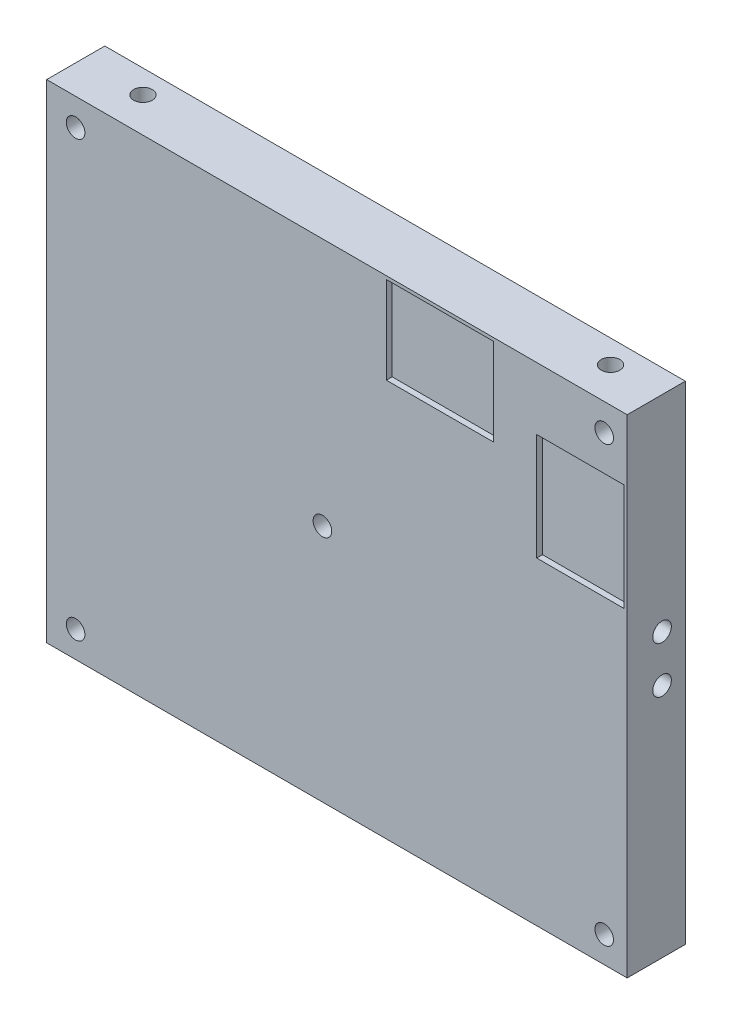
ISO-10303-21;
HEADER;
FILE_DESCRIPTION(('STEP AP214'),'2;1');
FILE_NAME('part.step','',(''),(''),'','','');
FILE_SCHEMA(('AUTOMOTIVE_DESIGN { 1 0 10303 214 1 1 1 1 }'));
ENDSEC;
DATA;
#1=APPLICATION_CONTEXT('core data for automotive mechanical design processes');
#2=APPLICATION_PROTOCOL_DEFINITION('international standard','automotive_design',2000,#1);
#3=PRODUCT_CONTEXT('',#1,'mechanical');
#4=PRODUCT('Part','Part','',(#3));
#5=PRODUCT_RELATED_PRODUCT_CATEGORY('part','',(#4));
#6=PRODUCT_DEFINITION_FORMATION('','',#4);
#7=PRODUCT_DEFINITION_CONTEXT('part definition',#1,'design');
#8=PRODUCT_DEFINITION('design','',#6,#7);
#9=PRODUCT_DEFINITION_SHAPE('','',#8);
#10=(LENGTH_UNIT() NAMED_UNIT(*) SI_UNIT(.MILLI.,.METRE.));
#11=(NAMED_UNIT(*) PLANE_ANGLE_UNIT() SI_UNIT($,.RADIAN.));
#12=(NAMED_UNIT(*) SI_UNIT($,.STERADIAN.) SOLID_ANGLE_UNIT());
#13=UNCERTAINTY_MEASURE_WITH_UNIT(LENGTH_MEASURE(1.E-05),#10,'distance_accuracy_value','');
#14=(GEOMETRIC_REPRESENTATION_CONTEXT(3) GLOBAL_UNCERTAINTY_ASSIGNED_CONTEXT((#13)) GLOBAL_UNIT_ASSIGNED_CONTEXT((#10,
#11,#12)) REPRESENTATION_CONTEXT('',''));
#15=CARTESIAN_POINT('',(0.,0.,0.));
#16=DIRECTION('',(0.,0.,1.));
#17=DIRECTION('',(1.,0.,0.));
#18=AXIS2_PLACEMENT_3D('',#15,#16,#17);
#19=CARTESIAN_POINT('',(0.,0.,2.248090434488));
#20=DIRECTION('',(0.,0.,-1.));
#21=DIRECTION('',(-1.,0.,0.));
#22=AXIS2_PLACEMENT_3D('',#19,#20,#21);
#23=PLANE('',#22);
#24=CARTESIAN_POINT('',(23.4282939266014,20.2767557921117,2.248090434488));
#25=DIRECTION('',(0.,0.,1.));
#26=DIRECTION('',(1.,0.,0.));
#27=AXIS2_PLACEMENT_3D('',#24,#25,#26);
#28=CIRCLE('',#27,0.799999999999999);
#29=CARTESIAN_POINT('',(24.2282939266014,20.2767557921117,2.248090434488));
#30=VERTEX_POINT('',#29);
#31=EDGE_CURVE('E49',#30,#30,#28,.T.);
#32=ORIENTED_EDGE('',*,*,#31,.F.);
#33=EDGE_LOOP('',(#32));
#34=FACE_BOUND('',#33,.T.);
#35=CARTESIAN_POINT('',(2.2062517625174,39.3337916061837,2.248090434488));
#36=DIRECTION('',(0.,0.,1.));
#37=DIRECTION('',(1.,0.,0.));
#38=AXIS2_PLACEMENT_3D('',#35,#36,#37);
#39=CIRCLE('',#38,0.8);
#40=CARTESIAN_POINT('',(3.0062517625174,39.3337916061837,2.248090434488));
#41=VERTEX_POINT('',#40);
#42=EDGE_CURVE('E233',#41,#41,#39,.T.);
#43=ORIENTED_EDGE('',*,*,#42,.F.);
#44=EDGE_LOOP('',(#43));
#45=FACE_BOUND('',#44,.T.);
#46=CARTESIAN_POINT('',(47.6533409166954,39.3337916061837,2.248090434488));
#47=DIRECTION('',(0.,0.,1.));
#48=DIRECTION('',(1.,0.,0.));
#49=AXIS2_PLACEMENT_3D('',#46,#47,#48);
#50=CIRCLE('',#49,0.800000000000002);
#51=CARTESIAN_POINT('',(48.4533409166954,39.3337916061837,2.248090434488));
#52=VERTEX_POINT('',#51);
#53=EDGE_CURVE('E239',#52,#52,#50,.T.);
#54=ORIENTED_EDGE('',*,*,#53,.F.);
#55=EDGE_LOOP('',(#54));
#56=FACE_BOUND('',#55,.T.);
#57=CARTESIAN_POINT('',(47.6533409166954,1.9767202320407,2.248090434488));
#58=DIRECTION('',(0.,0.,1.));
#59=DIRECTION('',(1.,0.,0.));
#60=AXIS2_PLACEMENT_3D('',#57,#58,#59);
#61=CIRCLE('',#60,0.800000000000002);
#62=CARTESIAN_POINT('',(48.4533409166954,1.9767202320407,2.248090434488));
#63=VERTEX_POINT('',#62);
#64=EDGE_CURVE('E245',#63,#63,#61,.T.);
#65=ORIENTED_EDGE('',*,*,#64,.F.);
#66=EDGE_LOOP('',(#65));
#67=FACE_BOUND('',#66,.T.);
#68=CARTESIAN_POINT('',(2.2062517625174,1.9767202320407,2.248090434488));
#69=DIRECTION('',(0.,0.,1.));
#70=DIRECTION('',(1.,0.,0.));
#71=AXIS2_PLACEMENT_3D('',#68,#69,#70);
#72=CIRCLE('',#71,0.8);
#73=CARTESIAN_POINT('',(3.0062517625174,1.9767202320407,2.248090434488));
#74=VERTEX_POINT('',#73);
#75=EDGE_CURVE('E251',#74,#74,#72,.T.);
#76=ORIENTED_EDGE('',*,*,#75,.F.);
#77=EDGE_LOOP('',(#76));
#78=FACE_BOUND('',#77,.T.);
#79=DIRECTION('',(1.,0.,0.));
#80=VECTOR('',#79,1.);
#81=CARTESIAN_POINT('',(41.85,27.1,2.248090434488));
#82=LINE('',#81,#80);
#83=CARTESIAN_POINT('',(41.85,27.1,2.248090434488));
#84=VERTEX_POINT('',#83);
#85=CARTESIAN_POINT('',(49.35,27.1,2.248090434488));
#86=VERTEX_POINT('',#85);
#87=EDGE_CURVE('E216',#84,#86,#82,.T.);
#88=ORIENTED_EDGE('',*,*,#87,.F.);
#89=DIRECTION('',(0.,-1.,0.));
#90=VECTOR('',#89,1.);
#91=CARTESIAN_POINT('',(41.85,27.1,2.248090434488));
#92=LINE('',#91,#90);
#93=CARTESIAN_POINT('',(41.85,36.3,2.248090434488));
#94=VERTEX_POINT('',#93);
#95=EDGE_CURVE('E194',#94,#84,#92,.T.);
#96=ORIENTED_EDGE('',*,*,#95,.F.);
#97=DIRECTION('',(-1.,0.,0.));
#98=VECTOR('',#97,1.);
#99=CARTESIAN_POINT('',(41.85,36.3,2.248090434488));
#100=LINE('',#99,#98);
#101=CARTESIAN_POINT('',(49.35,36.3,2.248090434488));
#102=VERTEX_POINT('',#101);
#103=EDGE_CURVE('E205',#102,#94,#100,.T.);
#104=ORIENTED_EDGE('',*,*,#103,.F.);
#105=DIRECTION('',(0.,1.,0.));
#106=VECTOR('',#105,1.);
#107=CARTESIAN_POINT('',(49.35,27.1,2.248090434488));
#108=LINE('',#107,#106);
#109=EDGE_CURVE('E219',#86,#102,#108,.T.);
#110=ORIENTED_EDGE('',*,*,#109,.F.);
#111=EDGE_LOOP('',(#88,#96,#104,#110));
#112=FACE_BOUND('',#111,.T.);
#113=DIRECTION('',(1.,0.,0.));
#114=VECTOR('',#113,1.);
#115=CARTESIAN_POINT('',(28.923,33.88,2.248090434488));
#116=LINE('',#115,#114);
#117=CARTESIAN_POINT('',(28.923,33.88,2.248090434488));
#118=VERTEX_POINT('',#117);
#119=CARTESIAN_POINT('',(38.123,33.88,2.248090434488));
#120=VERTEX_POINT('',#119);
#121=EDGE_CURVE('E184',#118,#120,#116,.T.);
#122=ORIENTED_EDGE('',*,*,#121,.F.);
#123=DIRECTION('',(0.,-1.,0.));
#124=VECTOR('',#123,1.);
#125=CARTESIAN_POINT('',(28.923,33.88,2.248090434488));
#126=LINE('',#125,#124);
#127=CARTESIAN_POINT('',(28.923,41.38,2.248090434488));
#128=VERTEX_POINT('',#127);
#129=EDGE_CURVE('E168',#128,#118,#126,.T.);
#130=ORIENTED_EDGE('',*,*,#129,.F.);
#131=DIRECTION('',(-1.,0.,0.));
#132=VECTOR('',#131,1.);
#133=CARTESIAN_POINT('',(28.923,41.38,2.248090434488));
#134=LINE('',#133,#132);
#135=CARTESIAN_POINT('',(38.123,41.38,2.248090434488));
#136=VERTEX_POINT('',#135);
#137=EDGE_CURVE('E173',#136,#128,#134,.T.);
#138=ORIENTED_EDGE('',*,*,#137,.F.);
#139=DIRECTION('',(0.,1.,0.));
#140=VECTOR('',#139,1.);
#141=CARTESIAN_POINT('',(38.123,33.88,2.248090434488));
#142=LINE('',#141,#140);
#143=EDGE_CURVE('E187',#120,#136,#142,.T.);
#144=ORIENTED_EDGE('',*,*,#143,.F.);
#145=EDGE_LOOP('',(#122,#130,#138,#144));
#146=FACE_BOUND('',#145,.T.);
#147=DIRECTION('',(0.,1.,0.));
#148=VECTOR('',#147,1.);
#149=CARTESIAN_POINT('',(-0.28,0.,2.248090434488));
#150=LINE('',#149,#148);
#151=CARTESIAN_POINT('',(-0.28,-0.28,2.248090434488));
#152=VERTEX_POINT('',#151);
#153=CARTESIAN_POINT('',(-0.28,41.66,2.248090434488));
#154=VERTEX_POINT('',#153);
#155=EDGE_CURVE('E166',#152,#154,#150,.T.);
#156=ORIENTED_EDGE('',*,*,#155,.F.);
#157=DIRECTION('',(-1.,0.,0.));
#158=VECTOR('',#157,1.);
#159=CARTESIAN_POINT('',(0.,-0.28,2.248090434488));
#160=LINE('',#159,#158);
#161=CARTESIAN_POINT('',(49.63,-0.28,2.248090434488));
#162=VERTEX_POINT('',#161);
#163=EDGE_CURVE('E164',#162,#152,#160,.T.);
#164=ORIENTED_EDGE('',*,*,#163,.F.);
#165=DIRECTION('',(0.,-1.,0.));
#166=VECTOR('',#165,1.);
#167=CARTESIAN_POINT('',(49.63,0.,2.248090434488));
#168=LINE('',#167,#166);
#169=CARTESIAN_POINT('',(49.63,41.66,2.248090434488));
#170=VERTEX_POINT('',#169);
#171=EDGE_CURVE('E137',#170,#162,#168,.T.);
#172=ORIENTED_EDGE('',*,*,#171,.F.);
#173=DIRECTION('',(1.,0.,0.));
#174=VECTOR('',#173,1.);
#175=CARTESIAN_POINT('',(0.,41.66,2.248090434488));
#176=LINE('',#175,#174);
#177=EDGE_CURVE('E158',#154,#170,#176,.T.);
#178=ORIENTED_EDGE('',*,*,#177,.F.);
#179=EDGE_LOOP('',(#156,#164,#172,#178));
#180=FACE_BOUND('',#179,.T.);
#181=ADVANCED_FACE('F45',(#34,#45,#56,#67,#78,#112,#146,#180),#23,.F.);
#182=CARTESIAN_POINT('',(0.,0.,-2.751909565512));
#183=DIRECTION('',(0.,0.,-1.));
#184=DIRECTION('',(-1.,0.,0.));
#185=AXIS2_PLACEMENT_3D('',#182,#183,#184);
#186=PLANE('',#185);
#187=CARTESIAN_POINT('',(23.4282939266014,20.2767557921117,-2.751909565512));
#188=DIRECTION('',(0.,0.,1.));
#189=DIRECTION('',(1.,0.,0.));
#190=AXIS2_PLACEMENT_3D('',#187,#188,#189);
#191=CIRCLE('',#190,0.799999999999999);
#192=CARTESIAN_POINT('',(24.2282939266014,20.2767557921117,-2.751909565512));
#193=VERTEX_POINT('',#192);
#194=EDGE_CURVE('E11',#193,#193,#191,.T.);
#195=ORIENTED_EDGE('',*,*,#194,.T.);
#196=EDGE_LOOP('',(#195));
#197=FACE_BOUND('',#196,.T.);
#198=CARTESIAN_POINT('',(2.2062517625174,39.3337916061837,-2.751909565512));
#199=DIRECTION('',(0.,0.,1.));
#200=DIRECTION('',(1.,0.,0.));
#201=AXIS2_PLACEMENT_3D('',#198,#199,#200);
#202=CIRCLE('',#201,0.8);
#203=CARTESIAN_POINT('',(3.0062517625174,39.3337916061837,-2.751909565512));
#204=VERTEX_POINT('',#203);
#205=EDGE_CURVE('E236',#204,#204,#202,.T.);
#206=ORIENTED_EDGE('',*,*,#205,.T.);
#207=EDGE_LOOP('',(#206));
#208=FACE_BOUND('',#207,.T.);
#209=CARTESIAN_POINT('',(47.6533409166954,39.3337916061837,-2.751909565512));
#210=DIRECTION('',(0.,0.,1.));
#211=DIRECTION('',(1.,0.,0.));
#212=AXIS2_PLACEMENT_3D('',#209,#210,#211);
#213=CIRCLE('',#212,0.800000000000002);
#214=CARTESIAN_POINT('',(48.4533409166954,39.3337916061837,-2.751909565512));
#215=VERTEX_POINT('',#214);
#216=EDGE_CURVE('E242',#215,#215,#213,.T.);
#217=ORIENTED_EDGE('',*,*,#216,.T.);
#218=EDGE_LOOP('',(#217));
#219=FACE_BOUND('',#218,.T.);
#220=CARTESIAN_POINT('',(47.6533409166954,1.9767202320407,-2.751909565512));
#221=DIRECTION('',(0.,0.,1.));
#222=DIRECTION('',(1.,0.,0.));
#223=AXIS2_PLACEMENT_3D('',#220,#221,#222);
#224=CIRCLE('',#223,0.800000000000002);
#225=CARTESIAN_POINT('',(48.4533409166954,1.9767202320407,-2.751909565512));
#226=VERTEX_POINT('',#225);
#227=EDGE_CURVE('E248',#226,#226,#224,.T.);
#228=ORIENTED_EDGE('',*,*,#227,.T.);
#229=EDGE_LOOP('',(#228));
#230=FACE_BOUND('',#229,.T.);
#231=CARTESIAN_POINT('',(2.2062517625174,1.9767202320407,-2.751909565512));
#232=DIRECTION('',(0.,0.,1.));
#233=DIRECTION('',(1.,0.,0.));
#234=AXIS2_PLACEMENT_3D('',#231,#232,#233);
#235=CIRCLE('',#234,0.8);
#236=CARTESIAN_POINT('',(3.0062517625174,1.9767202320407,-2.751909565512));
#237=VERTEX_POINT('',#236);
#238=EDGE_CURVE('E226',#237,#237,#235,.T.);
#239=ORIENTED_EDGE('',*,*,#238,.T.);
#240=EDGE_LOOP('',(#239));
#241=FACE_BOUND('',#240,.T.);
#242=DIRECTION('',(-1.,0.,0.));
#243=VECTOR('',#242,1.);
#244=CARTESIAN_POINT('',(-0.28,-0.28,-2.751909565512));
#245=LINE('',#244,#243);
#246=CARTESIAN_POINT('',(49.63,-0.28,-2.751909565512));
#247=VERTEX_POINT('',#246);
#248=CARTESIAN_POINT('',(-0.28,-0.28,-2.751909565512));
#249=VERTEX_POINT('',#248);
#250=EDGE_CURVE('E144',#247,#249,#245,.T.);
#251=ORIENTED_EDGE('',*,*,#250,.T.);
#252=DIRECTION('',(0.,1.,0.));
#253=VECTOR('',#252,1.);
#254=CARTESIAN_POINT('',(-0.28,-0.28,-2.751909565512));
#255=LINE('',#254,#253);
#256=CARTESIAN_POINT('',(-0.28,41.66,-2.751909565512));
#257=VERTEX_POINT('',#256);
#258=EDGE_CURVE('E154',#249,#257,#255,.T.);
#259=ORIENTED_EDGE('',*,*,#258,.T.);
#260=DIRECTION('',(1.,0.,0.));
#261=VECTOR('',#260,1.);
#262=CARTESIAN_POINT('',(-0.28,41.66,-2.751909565512));
#263=LINE('',#262,#261);
#264=CARTESIAN_POINT('',(49.63,41.66,-2.751909565512));
#265=VERTEX_POINT('',#264);
#266=EDGE_CURVE('E152',#257,#265,#263,.T.);
#267=ORIENTED_EDGE('',*,*,#266,.T.);
#268=DIRECTION('',(0.,-1.,0.));
#269=VECTOR('',#268,1.);
#270=CARTESIAN_POINT('',(49.63,-0.28,-2.751909565512));
#271=LINE('',#270,#269);
#272=EDGE_CURVE('E68',#265,#247,#271,.T.);
#273=ORIENTED_EDGE('',*,*,#272,.T.);
#274=EDGE_LOOP('',(#251,#259,#267,#273));
#275=FACE_BOUND('',#274,.T.);
#276=ADVANCED_FACE('F47',(#197,#208,#219,#230,#241,#275),#186,.T.);
#277=CARTESIAN_POINT('',(23.4282939266014,20.2767557921117,-2.751909565512));
#278=DIRECTION('',(0.,0.,1.));
#279=DIRECTION('',(1.,0.,0.));
#280=AXIS2_PLACEMENT_3D('',#277,#278,#279);
#281=CYLINDRICAL_SURFACE('',#280,0.799999999999999);
#282=ORIENTED_EDGE('',*,*,#194,.F.);
#283=EDGE_LOOP('',(#282));
#284=FACE_BOUND('',#283,.T.);
#285=ORIENTED_EDGE('',*,*,#31,.T.);
#286=EDGE_LOOP('',(#285));
#287=FACE_BOUND('',#286,.T.);
#288=ADVANCED_FACE('F458',(#284,#287),#281,.F.);
#289=CARTESIAN_POINT('',(2.2062517625174,39.3337916061837,-2.751909565512));
#290=DIRECTION('',(0.,0.,1.));
#291=DIRECTION('',(1.,0.,0.));
#292=AXIS2_PLACEMENT_3D('',#289,#290,#291);
#293=CYLINDRICAL_SURFACE('',#292,0.8);
#294=ORIENTED_EDGE('',*,*,#205,.F.);
#295=EDGE_LOOP('',(#294));
#296=FACE_BOUND('',#295,.T.);
#297=ORIENTED_EDGE('',*,*,#42,.T.);
#298=EDGE_LOOP('',(#297));
#299=FACE_BOUND('',#298,.T.);
#300=ADVANCED_FACE('F454',(#296,#299),#293,.F.);
#301=CARTESIAN_POINT('',(47.6533409166954,39.3337916061837,-2.751909565512));
#302=DIRECTION('',(0.,0.,1.));
#303=DIRECTION('',(1.,0.,0.));
#304=AXIS2_PLACEMENT_3D('',#301,#302,#303);
#305=CYLINDRICAL_SURFACE('',#304,0.800000000000002);
#306=ORIENTED_EDGE('',*,*,#216,.F.);
#307=EDGE_LOOP('',(#306));
#308=FACE_BOUND('',#307,.T.);
#309=ORIENTED_EDGE('',*,*,#53,.T.);
#310=EDGE_LOOP('',(#309));
#311=FACE_BOUND('',#310,.T.);
#312=ADVANCED_FACE('F457',(#308,#311),#305,.F.);
#313=CARTESIAN_POINT('',(47.6533409166954,1.9767202320407,-2.751909565512));
#314=DIRECTION('',(0.,0.,1.));
#315=DIRECTION('',(1.,0.,0.));
#316=AXIS2_PLACEMENT_3D('',#313,#314,#315);
#317=CYLINDRICAL_SURFACE('',#316,0.800000000000002);
#318=ORIENTED_EDGE('',*,*,#227,.F.);
#319=EDGE_LOOP('',(#318));
#320=FACE_BOUND('',#319,.T.);
#321=ORIENTED_EDGE('',*,*,#64,.T.);
#322=EDGE_LOOP('',(#321));
#323=FACE_BOUND('',#322,.T.);
#324=ADVANCED_FACE('F262',(#320,#323),#317,.F.);
#325=CARTESIAN_POINT('',(2.2062517625174,1.9767202320407,-2.751909565512));
#326=DIRECTION('',(0.,0.,1.));
#327=DIRECTION('',(1.,0.,0.));
#328=AXIS2_PLACEMENT_3D('',#325,#326,#327);
#329=CYLINDRICAL_SURFACE('',#328,0.8);
#330=ORIENTED_EDGE('',*,*,#238,.F.);
#331=EDGE_LOOP('',(#330));
#332=FACE_BOUND('',#331,.T.);
#333=ORIENTED_EDGE('',*,*,#75,.T.);
#334=EDGE_LOOP('',(#333));
#335=FACE_BOUND('',#334,.T.);
#336=ADVANCED_FACE('F258',(#332,#335),#329,.F.);
#337=CARTESIAN_POINT('',(41.85,27.1,1.748090434488));
#338=DIRECTION('',(-1.,0.,0.));
#339=DIRECTION('',(0.,0.,1.));
#340=AXIS2_PLACEMENT_3D('',#337,#338,#339);
#341=PLANE('',#340);
#342=ORIENTED_EDGE('',*,*,#95,.T.);
#343=DIRECTION('',(0.,0.,1.));
#344=VECTOR('',#343,1.);
#345=CARTESIAN_POINT('',(41.85,27.1,1.748090434488));
#346=LINE('',#345,#344);
#347=CARTESIAN_POINT('',(41.85,27.1,1.748090434488));
#348=VERTEX_POINT('',#347);
#349=EDGE_CURVE('E214',#348,#84,#346,.T.);
#350=ORIENTED_EDGE('',*,*,#349,.F.);
#351=DIRECTION('',(0.,-1.,0.));
#352=VECTOR('',#351,1.);
#353=CARTESIAN_POINT('',(41.85,27.1,1.748090434488));
#354=LINE('',#353,#352);
#355=CARTESIAN_POINT('',(41.85,36.3,1.748090434488));
#356=VERTEX_POINT('',#355);
#357=EDGE_CURVE('E201',#356,#348,#354,.T.);
#358=ORIENTED_EDGE('',*,*,#357,.F.);
#359=DIRECTION('',(0.,0.,1.));
#360=VECTOR('',#359,1.);
#361=CARTESIAN_POINT('',(41.85,36.3,1.748090434488));
#362=LINE('',#361,#360);
#363=EDGE_CURVE('E224',#356,#94,#362,.T.);
#364=ORIENTED_EDGE('',*,*,#363,.T.);
#365=EDGE_LOOP('',(#342,#350,#358,#364));
#366=FACE_BOUND('',#365,.T.);
#367=ADVANCED_FACE('F261',(#366),#341,.F.);
#368=CARTESIAN_POINT('',(41.85,36.3,1.748090434488));
#369=DIRECTION('',(0.,1.,0.));
#370=DIRECTION('',(0.,0.,1.));
#371=AXIS2_PLACEMENT_3D('',#368,#369,#370);
#372=PLANE('',#371);
#373=ORIENTED_EDGE('',*,*,#103,.T.);
#374=ORIENTED_EDGE('',*,*,#363,.F.);
#375=DIRECTION('',(-1.,0.,0.));
#376=VECTOR('',#375,1.);
#377=CARTESIAN_POINT('',(41.85,36.3,1.748090434488));
#378=LINE('',#377,#376);
#379=CARTESIAN_POINT('',(49.35,36.3,1.748090434488));
#380=VERTEX_POINT('',#379);
#381=EDGE_CURVE('E211',#380,#356,#378,.T.);
#382=ORIENTED_EDGE('',*,*,#381,.F.);
#383=DIRECTION('',(0.,0.,1.));
#384=VECTOR('',#383,1.);
#385=CARTESIAN_POINT('',(49.35,36.3,1.748090434488));
#386=LINE('',#385,#384);
#387=EDGE_CURVE('E227',#380,#102,#386,.T.);
#388=ORIENTED_EDGE('',*,*,#387,.T.);
#389=EDGE_LOOP('',(#373,#374,#382,#388));
#390=FACE_BOUND('',#389,.T.);
#391=ADVANCED_FACE('F440',(#390),#372,.F.);
#392=CARTESIAN_POINT('',(49.35,27.1,1.748090434488));
#393=DIRECTION('',(1.,0.,0.));
#394=DIRECTION('',(0.,0.,-1.));
#395=AXIS2_PLACEMENT_3D('',#392,#393,#394);
#396=PLANE('',#395);
#397=ORIENTED_EDGE('',*,*,#109,.T.);
#398=ORIENTED_EDGE('',*,*,#387,.F.);
#399=DIRECTION('',(0.,1.,0.));
#400=VECTOR('',#399,1.);
#401=CARTESIAN_POINT('',(49.35,27.1,1.748090434488));
#402=LINE('',#401,#400);
#403=CARTESIAN_POINT('',(49.35,27.1,1.748090434488));
#404=VERTEX_POINT('',#403);
#405=EDGE_CURVE('E208',#404,#380,#402,.T.);
#406=ORIENTED_EDGE('',*,*,#405,.F.);
#407=DIRECTION('',(0.,0.,1.));
#408=VECTOR('',#407,1.);
#409=CARTESIAN_POINT('',(49.35,27.1,1.748090434488));
#410=LINE('',#409,#408);
#411=EDGE_CURVE('E229',#404,#86,#410,.T.);
#412=ORIENTED_EDGE('',*,*,#411,.T.);
#413=EDGE_LOOP('',(#397,#398,#406,#412));
#414=FACE_BOUND('',#413,.T.);
#415=ADVANCED_FACE('F443',(#414),#396,.F.);
#416=CARTESIAN_POINT('',(41.85,27.1,1.748090434488));
#417=DIRECTION('',(0.,-1.,0.));
#418=DIRECTION('',(0.,0.,-1.));
#419=AXIS2_PLACEMENT_3D('',#416,#417,#418);
#420=PLANE('',#419);
#421=ORIENTED_EDGE('',*,*,#87,.T.);
#422=ORIENTED_EDGE('',*,*,#411,.F.);
#423=DIRECTION('',(1.,0.,0.));
#424=VECTOR('',#423,1.);
#425=CARTESIAN_POINT('',(41.85,27.1,1.748090434488));
#426=LINE('',#425,#424);
#427=EDGE_CURVE('E204',#348,#404,#426,.T.);
#428=ORIENTED_EDGE('',*,*,#427,.F.);
#429=ORIENTED_EDGE('',*,*,#349,.T.);
#430=EDGE_LOOP('',(#421,#422,#428,#429));
#431=FACE_BOUND('',#430,.T.);
#432=ADVANCED_FACE('F438',(#431),#420,.F.);
#433=CARTESIAN_POINT('',(0.,0.,1.748090434488));
#434=DIRECTION('',(0.,0.,-1.));
#435=DIRECTION('',(-1.,0.,0.));
#436=AXIS2_PLACEMENT_3D('',#433,#434,#435);
#437=PLANE('',#436);
#438=ORIENTED_EDGE('',*,*,#357,.T.);
#439=ORIENTED_EDGE('',*,*,#427,.T.);
#440=ORIENTED_EDGE('',*,*,#405,.T.);
#441=ORIENTED_EDGE('',*,*,#381,.T.);
#442=EDGE_LOOP('',(#438,#439,#440,#441));
#443=FACE_BOUND('',#442,.T.);
#444=ADVANCED_FACE('F434',(#443),#437,.F.);
#445=CARTESIAN_POINT('',(28.923,33.88,1.748090434488));
#446=DIRECTION('',(-1.,0.,0.));
#447=DIRECTION('',(0.,0.,1.));
#448=AXIS2_PLACEMENT_3D('',#445,#446,#447);
#449=PLANE('',#448);
#450=ORIENTED_EDGE('',*,*,#129,.T.);
#451=DIRECTION('',(0.,0.,1.));
#452=VECTOR('',#451,1.);
#453=CARTESIAN_POINT('',(28.923,33.88,1.748090434488));
#454=LINE('',#453,#452);
#455=CARTESIAN_POINT('',(28.923,33.88,1.748090434488));
#456=VERTEX_POINT('',#455);
#457=EDGE_CURVE('E182',#456,#118,#454,.T.);
#458=ORIENTED_EDGE('',*,*,#457,.F.);
#459=DIRECTION('',(0.,-1.,0.));
#460=VECTOR('',#459,1.);
#461=CARTESIAN_POINT('',(28.923,33.88,1.748090434488));
#462=LINE('',#461,#460);
#463=CARTESIAN_POINT('',(28.923,41.38,1.748090434488));
#464=VERTEX_POINT('',#463);
#465=EDGE_CURVE('E169',#464,#456,#462,.T.);
#466=ORIENTED_EDGE('',*,*,#465,.F.);
#467=DIRECTION('',(0.,0.,1.));
#468=VECTOR('',#467,1.);
#469=CARTESIAN_POINT('',(28.923,41.38,1.748090434488));
#470=LINE('',#469,#468);
#471=EDGE_CURVE('E192',#464,#128,#470,.T.);
#472=ORIENTED_EDGE('',*,*,#471,.T.);
#473=EDGE_LOOP('',(#450,#458,#466,#472));
#474=FACE_BOUND('',#473,.T.);
#475=ADVANCED_FACE('F424',(#474),#449,.F.);
#476=CARTESIAN_POINT('',(28.923,41.38,1.748090434488));
#477=DIRECTION('',(0.,1.,0.));
#478=DIRECTION('',(0.,0.,1.));
#479=AXIS2_PLACEMENT_3D('',#476,#477,#478);
#480=PLANE('',#479);
#481=ORIENTED_EDGE('',*,*,#137,.T.);
#482=ORIENTED_EDGE('',*,*,#471,.F.);
#483=DIRECTION('',(-1.,0.,0.));
#484=VECTOR('',#483,1.);
#485=CARTESIAN_POINT('',(28.923,41.38,1.748090434488));
#486=LINE('',#485,#484);
#487=CARTESIAN_POINT('',(38.123,41.38,1.748090434488));
#488=VERTEX_POINT('',#487);
#489=EDGE_CURVE('E179',#488,#464,#486,.T.);
#490=ORIENTED_EDGE('',*,*,#489,.F.);
#491=DIRECTION('',(0.,0.,1.));
#492=VECTOR('',#491,1.);
#493=CARTESIAN_POINT('',(38.123,41.38,1.748090434488));
#494=LINE('',#493,#492);
#495=EDGE_CURVE('E195',#488,#136,#494,.T.);
#496=ORIENTED_EDGE('',*,*,#495,.T.);
#497=EDGE_LOOP('',(#481,#482,#490,#496));
#498=FACE_BOUND('',#497,.T.);
#499=ADVANCED_FACE('F420',(#498),#480,.F.);
#500=CARTESIAN_POINT('',(38.123,33.88,1.748090434488));
#501=DIRECTION('',(1.,0.,0.));
#502=DIRECTION('',(0.,0.,-1.));
#503=AXIS2_PLACEMENT_3D('',#500,#501,#502);
#504=PLANE('',#503);
#505=ORIENTED_EDGE('',*,*,#143,.T.);
#506=ORIENTED_EDGE('',*,*,#495,.F.);
#507=DIRECTION('',(0.,1.,0.));
#508=VECTOR('',#507,1.);
#509=CARTESIAN_POINT('',(38.123,33.88,1.748090434488));
#510=LINE('',#509,#508);
#511=CARTESIAN_POINT('',(38.123,33.88,1.748090434488));
#512=VERTEX_POINT('',#511);
#513=EDGE_CURVE('E176',#512,#488,#510,.T.);
#514=ORIENTED_EDGE('',*,*,#513,.F.);
#515=DIRECTION('',(0.,0.,1.));
#516=VECTOR('',#515,1.);
#517=CARTESIAN_POINT('',(38.123,33.88,1.748090434488));
#518=LINE('',#517,#516);
#519=EDGE_CURVE('E197',#512,#120,#518,.T.);
#520=ORIENTED_EDGE('',*,*,#519,.T.);
#521=EDGE_LOOP('',(#505,#506,#514,#520));
#522=FACE_BOUND('',#521,.T.);
#523=ADVANCED_FACE('F423',(#522),#504,.F.);
#524=CARTESIAN_POINT('',(28.923,33.88,1.748090434488));
#525=DIRECTION('',(0.,-1.,0.));
#526=DIRECTION('',(0.,0.,-1.));
#527=AXIS2_PLACEMENT_3D('',#524,#525,#526);
#528=PLANE('',#527);
#529=ORIENTED_EDGE('',*,*,#121,.T.);
#530=ORIENTED_EDGE('',*,*,#519,.F.);
#531=DIRECTION('',(1.,0.,0.));
#532=VECTOR('',#531,1.);
#533=CARTESIAN_POINT('',(28.923,33.88,1.748090434488));
#534=LINE('',#533,#532);
#535=EDGE_CURVE('E172',#456,#512,#534,.T.);
#536=ORIENTED_EDGE('',*,*,#535,.F.);
#537=ORIENTED_EDGE('',*,*,#457,.T.);
#538=EDGE_LOOP('',(#529,#530,#536,#537));
#539=FACE_BOUND('',#538,.T.);
#540=ADVANCED_FACE('F418',(#539),#528,.F.);
#541=CARTESIAN_POINT('',(0.,0.,1.748090434488));
#542=DIRECTION('',(0.,0.,-1.));
#543=DIRECTION('',(-1.,0.,0.));
#544=AXIS2_PLACEMENT_3D('',#541,#542,#543);
#545=PLANE('',#544);
#546=ORIENTED_EDGE('',*,*,#465,.T.);
#547=ORIENTED_EDGE('',*,*,#535,.T.);
#548=ORIENTED_EDGE('',*,*,#513,.T.);
#549=ORIENTED_EDGE('',*,*,#489,.T.);
#550=EDGE_LOOP('',(#546,#547,#548,#549));
#551=FACE_BOUND('',#550,.T.);
#552=ADVANCED_FACE('F414',(#551),#545,.F.);
#553=CARTESIAN_POINT('',(-0.28,-0.28,2.348090434488));
#554=DIRECTION('',(-1.,0.,0.));
#555=DIRECTION('',(0.,0.,1.));
#556=AXIS2_PLACEMENT_3D('',#553,#554,#555);
#557=PLANE('',#556);
#558=CARTESIAN_POINT('',(-0.28,20.,-0.75));
#559=DIRECTION('',(-1.,0.,0.));
#560=DIRECTION('',(0.,0.,1.));
#561=AXIS2_PLACEMENT_3D('',#558,#559,#560);
#562=CIRCLE('',#561,0.8);
#563=CARTESIAN_POINT('',(-0.28,20.,0.05));
#564=VERTEX_POINT('',#563);
#565=EDGE_CURVE('E283',#564,#564,#562,.T.);
#566=ORIENTED_EDGE('',*,*,#565,.F.);
#567=EDGE_LOOP('',(#566));
#568=FACE_BOUND('',#567,.T.);
#569=CARTESIAN_POINT('',(-0.28,33.,-0.75));
#570=DIRECTION('',(-1.,0.,0.));
#571=DIRECTION('',(0.,0.,1.));
#572=AXIS2_PLACEMENT_3D('',#569,#570,#571);
#573=CIRCLE('',#572,0.8);
#574=CARTESIAN_POINT('',(-0.28,33.,0.05));
#575=VERTEX_POINT('',#574);
#576=EDGE_CURVE('E289',#575,#575,#573,.T.);
#577=ORIENTED_EDGE('',*,*,#576,.F.);
#578=EDGE_LOOP('',(#577));
#579=FACE_BOUND('',#578,.T.);
#580=ORIENTED_EDGE('',*,*,#155,.T.);
#581=DIRECTION('',(0.,0.,-1.));
#582=VECTOR('',#581,1.);
#583=CARTESIAN_POINT('',(-0.28,41.66,2.348090434488));
#584=LINE('',#583,#582);
#585=EDGE_CURVE('E60',#154,#257,#584,.T.);
#586=ORIENTED_EDGE('',*,*,#585,.T.);
#587=ORIENTED_EDGE('',*,*,#258,.F.);
#588=DIRECTION('',(0.,0.,-1.));
#589=VECTOR('',#588,1.);
#590=CARTESIAN_POINT('',(-0.28,-0.28,2.348090434488));
#591=LINE('',#590,#589);
#592=EDGE_CURVE('E140',#152,#249,#591,.T.);
#593=ORIENTED_EDGE('',*,*,#592,.F.);
#594=EDGE_LOOP('',(#580,#586,#587,#593));
#595=FACE_BOUND('',#594,.T.);
#596=ADVANCED_FACE('F280',(#568,#579,#595),#557,.T.);
#597=CARTESIAN_POINT('',(-0.28,-0.28,2.348090434488));
#598=DIRECTION('',(0.,-1.,0.));
#599=DIRECTION('',(0.,0.,-1.));
#600=AXIS2_PLACEMENT_3D('',#597,#598,#599);
#601=PLANE('',#600);
#602=CARTESIAN_POINT('',(14.5,-0.28,-0.75));
#603=DIRECTION('',(0.,-1.,0.));
#604=DIRECTION('',(0.,0.,-1.));
#605=AXIS2_PLACEMENT_3D('',#602,#603,#604);
#606=CIRCLE('',#605,0.8);
#607=CARTESIAN_POINT('',(14.5,-0.28,-1.55));
#608=VERTEX_POINT('',#607);
#609=EDGE_CURVE('E314',#608,#608,#606,.T.);
#610=ORIENTED_EDGE('',*,*,#609,.F.);
#611=EDGE_LOOP('',(#610));
#612=FACE_BOUND('',#611,.T.);
#613=CARTESIAN_POINT('',(34.85,-0.28,-0.75));
#614=DIRECTION('',(0.,-1.,0.));
#615=DIRECTION('',(0.,0.,-1.));
#616=AXIS2_PLACEMENT_3D('',#613,#614,#615);
#617=CIRCLE('',#616,0.800000000000002);
#618=CARTESIAN_POINT('',(34.85,-0.28,-1.55));
#619=VERTEX_POINT('',#618);
#620=EDGE_CURVE('E310',#619,#619,#617,.T.);
#621=ORIENTED_EDGE('',*,*,#620,.F.);
#622=EDGE_LOOP('',(#621));
#623=FACE_BOUND('',#622,.T.);
#624=ORIENTED_EDGE('',*,*,#163,.T.);
#625=ORIENTED_EDGE('',*,*,#592,.T.);
#626=ORIENTED_EDGE('',*,*,#250,.F.);
#627=DIRECTION('',(0.,0.,-1.));
#628=VECTOR('',#627,1.);
#629=CARTESIAN_POINT('',(49.63,-0.28,2.348090434488));
#630=LINE('',#629,#628);
#631=EDGE_CURVE('E133',#162,#247,#630,.T.);
#632=ORIENTED_EDGE('',*,*,#631,.F.);
#633=EDGE_LOOP('',(#624,#625,#626,#632));
#634=FACE_BOUND('',#633,.T.);
#635=ADVANCED_FACE('F145',(#612,#623,#634),#601,.T.);
#636=CARTESIAN_POINT('',(49.63,-0.28,2.348090434488));
#637=DIRECTION('',(1.,0.,0.));
#638=DIRECTION('',(0.,0.,-1.));
#639=AXIS2_PLACEMENT_3D('',#636,#637,#638);
#640=PLANE('',#639);
#641=CARTESIAN_POINT('',(49.63,20.,-0.75));
#642=DIRECTION('',(1.,0.,0.));
#643=DIRECTION('',(0.,0.,-1.));
#644=AXIS2_PLACEMENT_3D('',#641,#642,#643);
#645=CIRCLE('',#644,0.8);
#646=CARTESIAN_POINT('',(49.63,20.,-1.55));
#647=VERTEX_POINT('',#646);
#648=EDGE_CURVE('E302',#647,#647,#645,.T.);
#649=ORIENTED_EDGE('',*,*,#648,.F.);
#650=EDGE_LOOP('',(#649));
#651=FACE_BOUND('',#650,.T.);
#652=CARTESIAN_POINT('',(49.63,24.,-0.75));
#653=DIRECTION('',(1.,0.,0.));
#654=DIRECTION('',(0.,0.,-1.));
#655=AXIS2_PLACEMENT_3D('',#652,#653,#654);
#656=CIRCLE('',#655,0.8);
#657=CARTESIAN_POINT('',(49.63,24.,-1.55));
#658=VERTEX_POINT('',#657);
#659=EDGE_CURVE('E298',#658,#658,#656,.T.);
#660=ORIENTED_EDGE('',*,*,#659,.F.);
#661=EDGE_LOOP('',(#660));
#662=FACE_BOUND('',#661,.T.);
#663=ORIENTED_EDGE('',*,*,#171,.T.);
#664=ORIENTED_EDGE('',*,*,#631,.T.);
#665=ORIENTED_EDGE('',*,*,#272,.F.);
#666=DIRECTION('',(0.,0.,-1.));
#667=VECTOR('',#666,1.);
#668=CARTESIAN_POINT('',(49.63,41.66,2.348090434488));
#669=LINE('',#668,#667);
#670=EDGE_CURVE('E141',#170,#265,#669,.T.);
#671=ORIENTED_EDGE('',*,*,#670,.F.);
#672=EDGE_LOOP('',(#663,#664,#665,#671));
#673=FACE_BOUND('',#672,.T.);
#674=ADVANCED_FACE('F135',(#651,#662,#673),#640,.T.);
#675=CARTESIAN_POINT('',(-0.28,41.66,2.348090434488));
#676=DIRECTION('',(0.,1.,0.));
#677=DIRECTION('',(0.,0.,1.));
#678=AXIS2_PLACEMENT_3D('',#675,#676,#677);
#679=PLANE('',#678);
#680=CARTESIAN_POINT('',(5.,41.66,-0.75));
#681=DIRECTION('',(0.,1.,0.));
#682=DIRECTION('',(0.,0.,1.));
#683=AXIS2_PLACEMENT_3D('',#680,#681,#682);
#684=CIRCLE('',#683,0.8);
#685=CARTESIAN_POINT('',(5.,41.66,0.0500000000000003));
#686=VERTEX_POINT('',#685);
#687=EDGE_CURVE('E325',#686,#686,#684,.T.);
#688=ORIENTED_EDGE('',*,*,#687,.F.);
#689=EDGE_LOOP('',(#688));
#690=FACE_BOUND('',#689,.T.);
#691=CARTESIAN_POINT('',(45.2,41.66,-0.75));
#692=DIRECTION('',(0.,1.,0.));
#693=DIRECTION('',(0.,0.,1.));
#694=AXIS2_PLACEMENT_3D('',#691,#692,#693);
#695=CIRCLE('',#694,0.800000000000002);
#696=CARTESIAN_POINT('',(45.2,41.66,0.0500000000000021));
#697=VERTEX_POINT('',#696);
#698=EDGE_CURVE('E322',#697,#697,#695,.T.);
#699=ORIENTED_EDGE('',*,*,#698,.F.);
#700=EDGE_LOOP('',(#699));
#701=FACE_BOUND('',#700,.T.);
#702=ORIENTED_EDGE('',*,*,#177,.T.);
#703=ORIENTED_EDGE('',*,*,#670,.T.);
#704=ORIENTED_EDGE('',*,*,#266,.F.);
#705=ORIENTED_EDGE('',*,*,#585,.F.);
#706=EDGE_LOOP('',(#702,#703,#704,#705));
#707=FACE_BOUND('',#706,.T.);
#708=ADVANCED_FACE('F340',(#690,#701,#707),#679,.T.);
#709=CARTESIAN_POINT('',(4.72,33.,-0.75));
#710=DIRECTION('',(-1.,0.,0.));
#711=DIRECTION('',(0.,0.,1.));
#712=AXIS2_PLACEMENT_3D('',#709,#710,#711);
#713=CYLINDRICAL_SURFACE('',#712,0.8);
#714=CARTESIAN_POINT('',(4.72,33.,-0.75));
#715=DIRECTION('',(-1.,0.,0.));
#716=DIRECTION('',(0.,0.,1.));
#717=AXIS2_PLACEMENT_3D('',#714,#715,#716);
#718=CIRCLE('',#717,0.8);
#719=CARTESIAN_POINT('',(4.72,33.,0.05));
#720=VERTEX_POINT('',#719);
#721=EDGE_CURVE('E286',#720,#720,#718,.T.);
#722=ORIENTED_EDGE('',*,*,#721,.F.);
#723=EDGE_LOOP('',(#722));
#724=FACE_BOUND('',#723,.T.);
#725=ORIENTED_EDGE('',*,*,#576,.T.);
#726=EDGE_LOOP('',(#725));
#727=FACE_BOUND('',#726,.T.);
#728=ADVANCED_FACE('F343',(#724,#727),#713,.F.);
#729=CARTESIAN_POINT('',(4.72,33.,-0.75));
#730=DIRECTION('',(-1.,0.,0.));
#731=DIRECTION('',(0.,0.,1.));
#732=AXIS2_PLACEMENT_3D('',#729,#730,#731);
#733=PLANE('',#732);
#734=ORIENTED_EDGE('',*,*,#721,.T.);
#735=EDGE_LOOP('',(#734));
#736=FACE_BOUND('',#735,.T.);
#737=ADVANCED_FACE('F398',(#736),#733,.T.);
#738=CARTESIAN_POINT('',(4.72,20.,-0.75));
#739=DIRECTION('',(-1.,0.,0.));
#740=DIRECTION('',(0.,0.,1.));
#741=AXIS2_PLACEMENT_3D('',#738,#739,#740);
#742=CYLINDRICAL_SURFACE('',#741,0.8);
#743=CARTESIAN_POINT('',(4.72,20.,-0.75));
#744=DIRECTION('',(-1.,0.,0.));
#745=DIRECTION('',(0.,0.,1.));
#746=AXIS2_PLACEMENT_3D('',#743,#744,#745);
#747=CIRCLE('',#746,0.8);
#748=CARTESIAN_POINT('',(4.72,20.,0.05));
#749=VERTEX_POINT('',#748);
#750=EDGE_CURVE('E281',#749,#749,#747,.T.);
#751=ORIENTED_EDGE('',*,*,#750,.F.);
#752=EDGE_LOOP('',(#751));
#753=FACE_BOUND('',#752,.T.);
#754=ORIENTED_EDGE('',*,*,#565,.T.);
#755=EDGE_LOOP('',(#754));
#756=FACE_BOUND('',#755,.T.);
#757=ADVANCED_FACE('F394',(#753,#756),#742,.F.);
#758=CARTESIAN_POINT('',(4.72,20.,-0.75));
#759=DIRECTION('',(-1.,0.,0.));
#760=DIRECTION('',(0.,0.,1.));
#761=AXIS2_PLACEMENT_3D('',#758,#759,#760);
#762=PLANE('',#761);
#763=ORIENTED_EDGE('',*,*,#750,.T.);
#764=EDGE_LOOP('',(#763));
#765=FACE_BOUND('',#764,.T.);
#766=ADVANCED_FACE('F387',(#765),#762,.T.);
#767=CARTESIAN_POINT('',(44.63,24.,-0.75));
#768=DIRECTION('',(1.,0.,0.));
#769=DIRECTION('',(0.,0.,-1.));
#770=AXIS2_PLACEMENT_3D('',#767,#768,#769);
#771=CYLINDRICAL_SURFACE('',#770,0.8);
#772=CARTESIAN_POINT('',(44.63,24.,-0.75));
#773=DIRECTION('',(1.,0.,0.));
#774=DIRECTION('',(0.,0.,-1.));
#775=AXIS2_PLACEMENT_3D('',#772,#773,#774);
#776=CIRCLE('',#775,0.8);
#777=CARTESIAN_POINT('',(44.63,24.,-1.55));
#778=VERTEX_POINT('',#777);
#779=EDGE_CURVE('E295',#778,#778,#776,.T.);
#780=ORIENTED_EDGE('',*,*,#779,.F.);
#781=EDGE_LOOP('',(#780));
#782=FACE_BOUND('',#781,.T.);
#783=ORIENTED_EDGE('',*,*,#659,.T.);
#784=EDGE_LOOP('',(#783));
#785=FACE_BOUND('',#784,.T.);
#786=ADVANCED_FACE('F384',(#782,#785),#771,.F.);
#787=CARTESIAN_POINT('',(44.63,24.,-0.75));
#788=DIRECTION('',(1.,0.,0.));
#789=DIRECTION('',(0.,0.,-1.));
#790=AXIS2_PLACEMENT_3D('',#787,#788,#789);
#791=PLANE('',#790);
#792=ORIENTED_EDGE('',*,*,#779,.T.);
#793=EDGE_LOOP('',(#792));
#794=FACE_BOUND('',#793,.T.);
#795=ADVANCED_FACE('F382',(#794),#791,.T.);
#796=CARTESIAN_POINT('',(44.63,20.,-0.75));
#797=DIRECTION('',(1.,0.,0.));
#798=DIRECTION('',(0.,0.,-1.));
#799=AXIS2_PLACEMENT_3D('',#796,#797,#798);
#800=CYLINDRICAL_SURFACE('',#799,0.8);
#801=CARTESIAN_POINT('',(44.63,20.,-0.75));
#802=DIRECTION('',(1.,0.,0.));
#803=DIRECTION('',(0.,0.,-1.));
#804=AXIS2_PLACEMENT_3D('',#801,#802,#803);
#805=CIRCLE('',#804,0.8);
#806=CARTESIAN_POINT('',(44.63,20.,-1.55));
#807=VERTEX_POINT('',#806);
#808=EDGE_CURVE('E290',#807,#807,#805,.T.);
#809=ORIENTED_EDGE('',*,*,#808,.F.);
#810=EDGE_LOOP('',(#809));
#811=FACE_BOUND('',#810,.T.);
#812=ORIENTED_EDGE('',*,*,#648,.T.);
#813=EDGE_LOOP('',(#812));
#814=FACE_BOUND('',#813,.T.);
#815=ADVANCED_FACE('F378',(#811,#814),#800,.F.);
#816=CARTESIAN_POINT('',(44.63,20.,-0.75));
#817=DIRECTION('',(1.,0.,0.));
#818=DIRECTION('',(0.,0.,-1.));
#819=AXIS2_PLACEMENT_3D('',#816,#817,#818);
#820=PLANE('',#819);
#821=ORIENTED_EDGE('',*,*,#808,.T.);
#822=EDGE_LOOP('',(#821));
#823=FACE_BOUND('',#822,.T.);
#824=ADVANCED_FACE('F371',(#823),#820,.T.);
#825=CARTESIAN_POINT('',(34.85,4.72,-0.75));
#826=DIRECTION('',(0.,-1.,0.));
#827=DIRECTION('',(0.,0.,-1.));
#828=AXIS2_PLACEMENT_3D('',#825,#826,#827);
#829=CYLINDRICAL_SURFACE('',#828,0.800000000000002);
#830=CARTESIAN_POINT('',(34.85,4.72,-0.75));
#831=DIRECTION('',(0.,-1.,0.));
#832=DIRECTION('',(0.,0.,-1.));
#833=AXIS2_PLACEMENT_3D('',#830,#831,#832);
#834=CIRCLE('',#833,0.800000000000002);
#835=CARTESIAN_POINT('',(34.85,4.72,-1.55));
#836=VERTEX_POINT('',#835);
#837=EDGE_CURVE('E307',#836,#836,#834,.T.);
#838=ORIENTED_EDGE('',*,*,#837,.F.);
#839=EDGE_LOOP('',(#838));
#840=FACE_BOUND('',#839,.T.);
#841=ORIENTED_EDGE('',*,*,#620,.T.);
#842=EDGE_LOOP('',(#841));
#843=FACE_BOUND('',#842,.T.);
#844=ADVANCED_FACE('F368',(#840,#843),#829,.F.);
#845=CARTESIAN_POINT('',(34.85,4.72,-0.75));
#846=DIRECTION('',(0.,-1.,0.));
#847=DIRECTION('',(0.,0.,-1.));
#848=AXIS2_PLACEMENT_3D('',#845,#846,#847);
#849=PLANE('',#848);
#850=ORIENTED_EDGE('',*,*,#837,.T.);
#851=EDGE_LOOP('',(#850));
#852=FACE_BOUND('',#851,.T.);
#853=ADVANCED_FACE('F366',(#852),#849,.T.);
#854=CARTESIAN_POINT('',(14.5,4.72,-0.75));
#855=DIRECTION('',(0.,-1.,0.));
#856=DIRECTION('',(0.,0.,-1.));
#857=AXIS2_PLACEMENT_3D('',#854,#855,#856);
#858=CYLINDRICAL_SURFACE('',#857,0.8);
#859=CARTESIAN_POINT('',(14.5,4.72,-0.75));
#860=DIRECTION('',(0.,-1.,0.));
#861=DIRECTION('',(0.,0.,-1.));
#862=AXIS2_PLACEMENT_3D('',#859,#860,#861);
#863=CIRCLE('',#862,0.8);
#864=CARTESIAN_POINT('',(14.5,4.72,-1.55));
#865=VERTEX_POINT('',#864);
#866=EDGE_CURVE('E299',#865,#865,#863,.T.);
#867=ORIENTED_EDGE('',*,*,#866,.F.);
#868=EDGE_LOOP('',(#867));
#869=FACE_BOUND('',#868,.T.);
#870=ORIENTED_EDGE('',*,*,#609,.T.);
#871=EDGE_LOOP('',(#870));
#872=FACE_BOUND('',#871,.T.);
#873=ADVANCED_FACE('F358',(#869,#872),#858,.F.);
#874=CARTESIAN_POINT('',(14.5,4.72,-0.75));
#875=DIRECTION('',(0.,-1.,0.));
#876=DIRECTION('',(0.,0.,-1.));
#877=AXIS2_PLACEMENT_3D('',#874,#875,#876);
#878=PLANE('',#877);
#879=ORIENTED_EDGE('',*,*,#866,.T.);
#880=EDGE_LOOP('',(#879));
#881=FACE_BOUND('',#880,.T.);
#882=ADVANCED_FACE('F349',(#881),#878,.T.);
#883=CARTESIAN_POINT('',(45.2,36.66,-0.75));
#884=DIRECTION('',(0.,1.,0.));
#885=DIRECTION('',(0.,0.,1.));
#886=AXIS2_PLACEMENT_3D('',#883,#884,#885);
#887=CYLINDRICAL_SURFACE('',#886,0.800000000000002);
#888=CARTESIAN_POINT('',(45.2,36.66,-0.75));
#889=DIRECTION('',(0.,1.,0.));
#890=DIRECTION('',(0.,0.,1.));
#891=AXIS2_PLACEMENT_3D('',#888,#889,#890);
#892=CIRCLE('',#891,0.800000000000002);
#893=CARTESIAN_POINT('',(45.2,36.66,0.0500000000000021));
#894=VERTEX_POINT('',#893);
#895=EDGE_CURVE('E319',#894,#894,#892,.T.);
#896=ORIENTED_EDGE('',*,*,#895,.F.);
#897=EDGE_LOOP('',(#896));
#898=FACE_BOUND('',#897,.T.);
#899=ORIENTED_EDGE('',*,*,#698,.T.);
#900=EDGE_LOOP('',(#899));
#901=FACE_BOUND('',#900,.T.);
#902=ADVANCED_FACE('F347',(#898,#901),#887,.F.);
#903=CARTESIAN_POINT('',(45.2,36.66,-0.75));
#904=DIRECTION('',(0.,1.,0.));
#905=DIRECTION('',(0.,0.,1.));
#906=AXIS2_PLACEMENT_3D('',#903,#904,#905);
#907=PLANE('',#906);
#908=ORIENTED_EDGE('',*,*,#895,.T.);
#909=EDGE_LOOP('',(#908));
#910=FACE_BOUND('',#909,.T.);
#911=ADVANCED_FACE('F336',(#910),#907,.T.);
#912=CARTESIAN_POINT('',(5.,36.66,-0.75));
#913=DIRECTION('',(0.,1.,0.));
#914=DIRECTION('',(0.,0.,1.));
#915=AXIS2_PLACEMENT_3D('',#912,#913,#914);
#916=CYLINDRICAL_SURFACE('',#915,0.8);
#917=CARTESIAN_POINT('',(5.,36.66,-0.75));
#918=DIRECTION('',(0.,1.,0.));
#919=DIRECTION('',(0.,0.,1.));
#920=AXIS2_PLACEMENT_3D('',#917,#918,#919);
#921=CIRCLE('',#920,0.8);
#922=CARTESIAN_POINT('',(5.,36.66,0.0500000000000003));
#923=VERTEX_POINT('',#922);
#924=EDGE_CURVE('E311',#923,#923,#921,.T.);
#925=ORIENTED_EDGE('',*,*,#924,.F.);
#926=EDGE_LOOP('',(#925));
#927=FACE_BOUND('',#926,.T.);
#928=ORIENTED_EDGE('',*,*,#687,.T.);
#929=EDGE_LOOP('',(#928));
#930=FACE_BOUND('',#929,.T.);
#931=ADVANCED_FACE('F333',(#927,#930),#916,.F.);
#932=CARTESIAN_POINT('',(5.,36.66,-0.75));
#933=DIRECTION('',(0.,1.,0.));
#934=DIRECTION('',(0.,0.,1.));
#935=AXIS2_PLACEMENT_3D('',#932,#933,#934);
#936=PLANE('',#935);
#937=ORIENTED_EDGE('',*,*,#924,.T.);
#938=EDGE_LOOP('',(#937));
#939=FACE_BOUND('',#938,.T.);
#940=ADVANCED_FACE('F331',(#939),#936,.T.);
#941=CLOSED_SHELL('',(#181,#276,#288,#300,#312,#324,#336,#367,#391,#415,#432,#444,#475,#499,
#523,#540,#552,#596,#635,#674,#708,#728,#737,#757,#766,#786,#795,#815,#824,#844,#853,#873,#882,
#902,#911,#931,#940));
#942=MANIFOLD_SOLID_BREP('B2',#941);
#943=ADVANCED_BREP_SHAPE_REPRESENTATION('',(#18,#942),#14);
#944=SHAPE_DEFINITION_REPRESENTATION(#9,#943);
ENDSEC;
END-ISO-10303-21;
